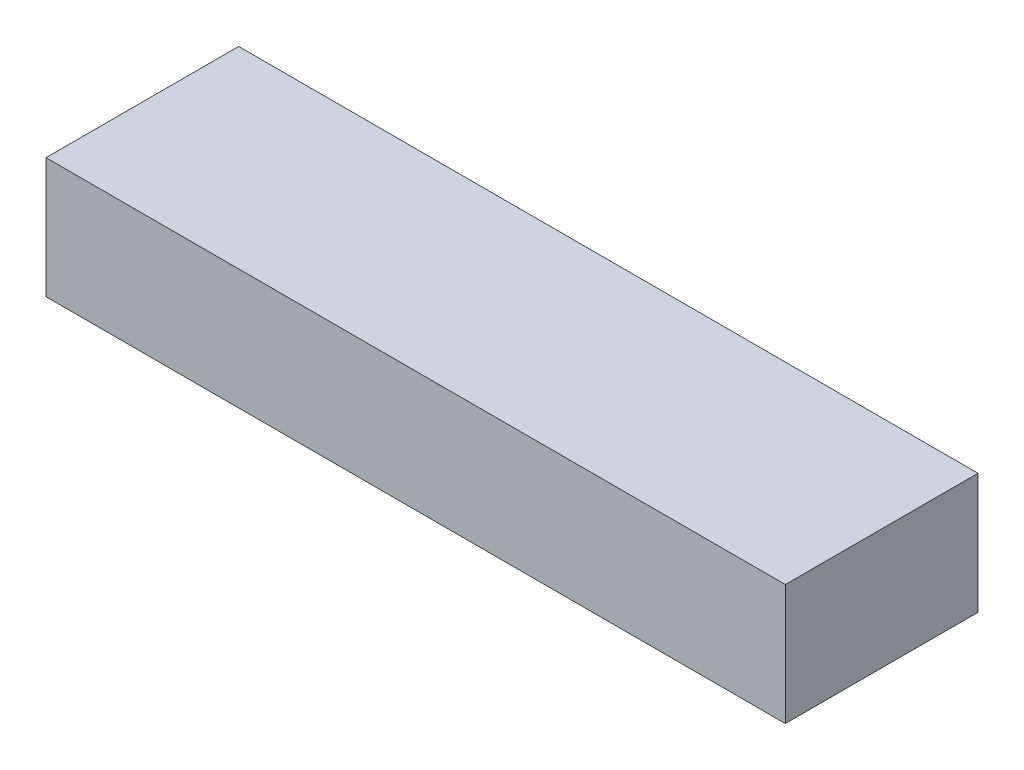
ISO-10303-21;
HEADER;
FILE_DESCRIPTION(('STEP AP214'),'2;1');
FILE_NAME('part.step','',(''),(''),'','','');
FILE_SCHEMA(('AUTOMOTIVE_DESIGN { 1 0 10303 214 1 1 1 1 }'));
ENDSEC;
DATA;
#1=APPLICATION_CONTEXT('core data for automotive mechanical design processes');
#2=APPLICATION_PROTOCOL_DEFINITION('international standard','automotive_design',2000,#1);
#3=PRODUCT_CONTEXT('',#1,'mechanical');
#4=PRODUCT('Part','Part','',(#3));
#5=PRODUCT_RELATED_PRODUCT_CATEGORY('part','',(#4));
#6=PRODUCT_DEFINITION_FORMATION('','',#4);
#7=PRODUCT_DEFINITION_CONTEXT('part definition',#1,'design');
#8=PRODUCT_DEFINITION('design','',#6,#7);
#9=PRODUCT_DEFINITION_SHAPE('','',#8);
#10=(LENGTH_UNIT() NAMED_UNIT(*) SI_UNIT(.MILLI.,.METRE.));
#11=(NAMED_UNIT(*) PLANE_ANGLE_UNIT() SI_UNIT($,.RADIAN.));
#12=(NAMED_UNIT(*) SI_UNIT($,.STERADIAN.) SOLID_ANGLE_UNIT());
#13=UNCERTAINTY_MEASURE_WITH_UNIT(LENGTH_MEASURE(1.E-05),#10,'distance_accuracy_value','');
#14=(GEOMETRIC_REPRESENTATION_CONTEXT(3) GLOBAL_UNCERTAINTY_ASSIGNED_CONTEXT((#13)) GLOBAL_UNIT_ASSIGNED_CONTEXT((#10,
#11,#12)) REPRESENTATION_CONTEXT('',''));
#15=CARTESIAN_POINT('',(0.,0.,0.));
#16=DIRECTION('',(0.,0.,1.));
#17=DIRECTION('',(1.,0.,0.));
#18=AXIS2_PLACEMENT_3D('',#15,#16,#17);
#19=CARTESIAN_POINT('',(0.,18.923,0.));
#20=DIRECTION('',(1.,0.,0.));
#21=DIRECTION('',(0.,0.,-1.));
#22=AXIS2_PLACEMENT_3D('',#19,#20,#21);
#23=PLANE('',#22);
#24=DIRECTION('',(0.,0.,1.));
#25=VECTOR('',#24,1.);
#26=CARTESIAN_POINT('',(0.,0.,0.));
#27=LINE('',#26,#25);
#28=CARTESIAN_POINT('',(0.,0.,-30.2768));
#29=VERTEX_POINT('',#28);
#30=CARTESIAN_POINT('',(0.,0.,0.));
#31=VERTEX_POINT('',#30);
#32=EDGE_CURVE('E99',#29,#31,#27,.T.);
#33=ORIENTED_EDGE('',*,*,#32,.T.);
#34=DIRECTION('',(0.,-1.,0.));
#35=VECTOR('',#34,1.);
#36=CARTESIAN_POINT('',(0.,18.923,0.));
#37=LINE('',#36,#35);
#38=CARTESIAN_POINT('',(0.,18.923,0.));
#39=VERTEX_POINT('',#38);
#40=EDGE_CURVE('E11',#39,#31,#37,.T.);
#41=ORIENTED_EDGE('',*,*,#40,.F.);
#42=DIRECTION('',(0.,0.,1.));
#43=VECTOR('',#42,1.);
#44=CARTESIAN_POINT('',(0.,18.923,0.));
#45=LINE('',#44,#43);
#46=CARTESIAN_POINT('',(0.,18.923,-30.2768));
#47=VERTEX_POINT('',#46);
#48=EDGE_CURVE('E87',#47,#39,#45,.T.);
#49=ORIENTED_EDGE('',*,*,#48,.F.);
#50=DIRECTION('',(0.,-1.,0.));
#51=VECTOR('',#50,1.);
#52=CARTESIAN_POINT('',(0.,18.923,-30.2768));
#53=LINE('',#52,#51);
#54=EDGE_CURVE('E95',#47,#29,#53,.T.);
#55=ORIENTED_EDGE('',*,*,#54,.T.);
#56=EDGE_LOOP('',(#33,#41,#49,#55));
#57=FACE_BOUND('',#56,.T.);
#58=ADVANCED_FACE('F36',(#57),#23,.F.);
#59=CARTESIAN_POINT('',(0.,18.923,0.));
#60=DIRECTION('',(0.,0.,-1.));
#61=DIRECTION('',(-1.,0.,0.));
#62=AXIS2_PLACEMENT_3D('',#59,#60,#61);
#63=PLANE('',#62);
#64=DIRECTION('',(1.,0.,0.));
#65=VECTOR('',#64,1.);
#66=CARTESIAN_POINT('',(0.,0.,0.));
#67=LINE('',#66,#65);
#68=CARTESIAN_POINT('',(116.1796,0.,0.));
#69=VERTEX_POINT('',#68);
#70=EDGE_CURVE('E91',#31,#69,#67,.T.);
#71=ORIENTED_EDGE('',*,*,#70,.T.);
#72=DIRECTION('',(0.,-1.,0.));
#73=VECTOR('',#72,1.);
#74=CARTESIAN_POINT('',(116.1796,18.923,0.));
#75=LINE('',#74,#73);
#76=CARTESIAN_POINT('',(116.1796,18.923,0.));
#77=VERTEX_POINT('',#76);
#78=EDGE_CURVE('E44',#77,#69,#75,.T.);
#79=ORIENTED_EDGE('',*,*,#78,.F.);
#80=DIRECTION('',(1.,0.,0.));
#81=VECTOR('',#80,1.);
#82=CARTESIAN_POINT('',(0.,18.923,0.));
#83=LINE('',#82,#81);
#84=EDGE_CURVE('E82',#39,#77,#83,.T.);
#85=ORIENTED_EDGE('',*,*,#84,.F.);
#86=ORIENTED_EDGE('',*,*,#40,.T.);
#87=EDGE_LOOP('',(#71,#79,#85,#86));
#88=FACE_BOUND('',#87,.T.);
#89=ADVANCED_FACE('F90',(#88),#63,.F.);
#90=CARTESIAN_POINT('',(116.1796,18.923,0.));
#91=DIRECTION('',(-1.,0.,0.));
#92=DIRECTION('',(0.,0.,1.));
#93=AXIS2_PLACEMENT_3D('',#90,#91,#92);
#94=PLANE('',#93);
#95=DIRECTION('',(0.,0.,-1.));
#96=VECTOR('',#95,1.);
#97=CARTESIAN_POINT('',(116.1796,0.,0.));
#98=LINE('',#97,#96);
#99=CARTESIAN_POINT('',(116.1796,0.,-30.2768));
#100=VERTEX_POINT('',#99);
#101=EDGE_CURVE('E69',#69,#100,#98,.T.);
#102=ORIENTED_EDGE('',*,*,#101,.T.);
#103=DIRECTION('',(0.,-1.,0.));
#104=VECTOR('',#103,1.);
#105=CARTESIAN_POINT('',(116.1796,18.923,-30.2768));
#106=LINE('',#105,#104);
#107=CARTESIAN_POINT('',(116.1796,18.923,-30.2768));
#108=VERTEX_POINT('',#107);
#109=EDGE_CURVE('E92',#108,#100,#106,.T.);
#110=ORIENTED_EDGE('',*,*,#109,.F.);
#111=DIRECTION('',(0.,0.,-1.));
#112=VECTOR('',#111,1.);
#113=CARTESIAN_POINT('',(116.1796,18.923,0.));
#114=LINE('',#113,#112);
#115=EDGE_CURVE('E85',#77,#108,#114,.T.);
#116=ORIENTED_EDGE('',*,*,#115,.F.);
#117=ORIENTED_EDGE('',*,*,#78,.T.);
#118=EDGE_LOOP('',(#102,#110,#116,#117));
#119=FACE_BOUND('',#118,.T.);
#120=ADVANCED_FACE('F93',(#119),#94,.F.);
#121=CARTESIAN_POINT('',(0.,18.923,-30.2768));
#122=DIRECTION('',(0.,0.,1.));
#123=DIRECTION('',(1.,0.,0.));
#124=AXIS2_PLACEMENT_3D('',#121,#122,#123);
#125=PLANE('',#124);
#126=DIRECTION('',(-1.,0.,0.));
#127=VECTOR('',#126,1.);
#128=CARTESIAN_POINT('',(0.,0.,-30.2768));
#129=LINE('',#128,#127);
#130=EDGE_CURVE('E75',#100,#29,#129,.T.);
#131=ORIENTED_EDGE('',*,*,#130,.T.);
#132=ORIENTED_EDGE('',*,*,#54,.F.);
#133=DIRECTION('',(-1.,0.,0.));
#134=VECTOR('',#133,1.);
#135=CARTESIAN_POINT('',(0.,18.923,-30.2768));
#136=LINE('',#135,#134);
#137=EDGE_CURVE('E52',#108,#47,#136,.T.);
#138=ORIENTED_EDGE('',*,*,#137,.F.);
#139=ORIENTED_EDGE('',*,*,#109,.T.);
#140=EDGE_LOOP('',(#131,#132,#138,#139));
#141=FACE_BOUND('',#140,.T.);
#142=ADVANCED_FACE('F106',(#141),#125,.F.);
#143=CARTESIAN_POINT('',(0.,18.923,0.));
#144=DIRECTION('',(0.,-1.,0.));
#145=DIRECTION('',(0.,0.,-1.));
#146=AXIS2_PLACEMENT_3D('',#143,#144,#145);
#147=PLANE('',#146);
#148=ORIENTED_EDGE('',*,*,#48,.T.);
#149=ORIENTED_EDGE('',*,*,#84,.T.);
#150=ORIENTED_EDGE('',*,*,#115,.T.);
#151=ORIENTED_EDGE('',*,*,#137,.T.);
#152=EDGE_LOOP('',(#148,#149,#150,#151));
#153=FACE_BOUND('',#152,.T.);
#154=ADVANCED_FACE('F83',(#153),#147,.F.);
#155=CARTESIAN_POINT('',(0.,0.,0.));
#156=DIRECTION('',(0.,-1.,0.));
#157=DIRECTION('',(0.,0.,-1.));
#158=AXIS2_PLACEMENT_3D('',#155,#156,#157);
#159=PLANE('',#158);
#160=ORIENTED_EDGE('',*,*,#32,.F.);
#161=ORIENTED_EDGE('',*,*,#130,.F.);
#162=ORIENTED_EDGE('',*,*,#101,.F.);
#163=ORIENTED_EDGE('',*,*,#70,.F.);
#164=EDGE_LOOP('',(#160,#161,#162,#163));
#165=FACE_BOUND('',#164,.T.);
#166=ADVANCED_FACE('F109',(#165),#159,.T.);
#167=CLOSED_SHELL('',(#58,#89,#120,#142,#154,#166));
#168=MANIFOLD_SOLID_BREP('B2',#167);
#169=ADVANCED_BREP_SHAPE_REPRESENTATION('',(#18,#168),#14);
#170=SHAPE_DEFINITION_REPRESENTATION(#9,#169);
ENDSEC;
END-ISO-10303-21;
